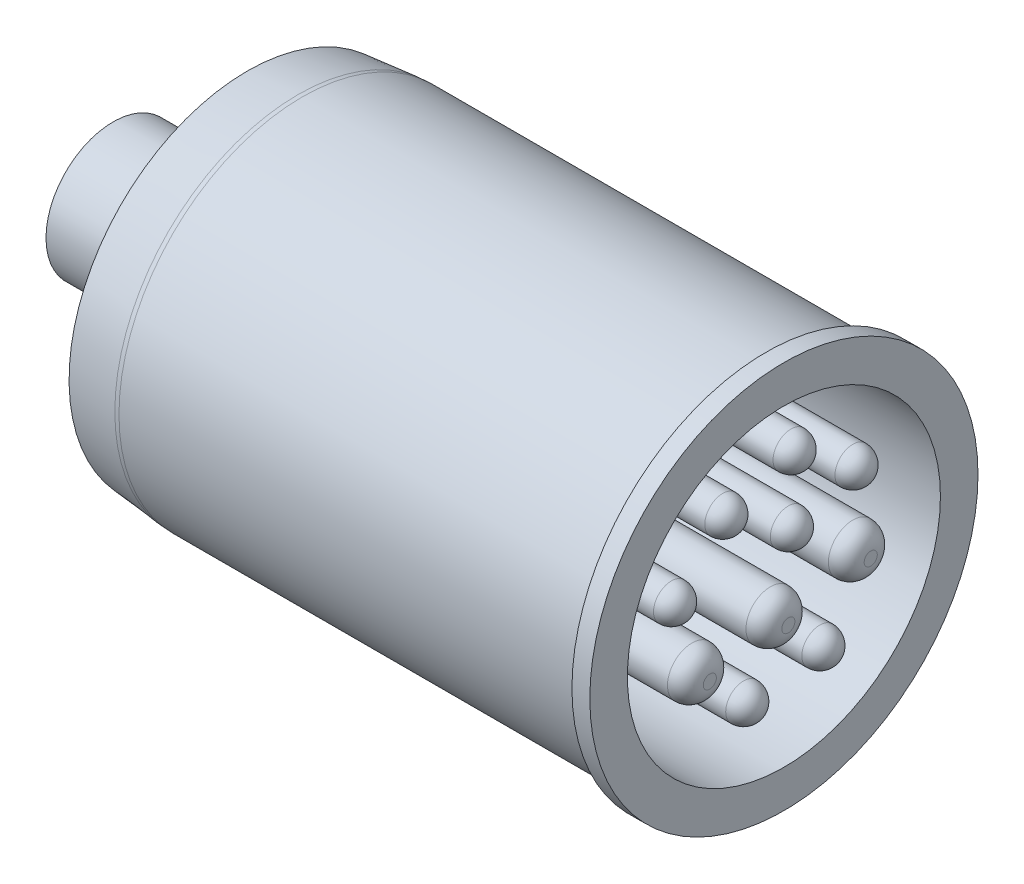
ISO-10303-21;
HEADER;
FILE_DESCRIPTION(('STEP AP214'),'2;1');
FILE_NAME('part.step','',(''),(''),'','','');
FILE_SCHEMA(('AUTOMOTIVE_DESIGN { 1 0 10303 214 1 1 1 1 }'));
ENDSEC;
DATA;
#1=APPLICATION_CONTEXT('core data for automotive mechanical design processes');
#2=APPLICATION_PROTOCOL_DEFINITION('international standard','automotive_design',2000,#1);
#3=PRODUCT_CONTEXT('',#1,'mechanical');
#4=PRODUCT('Part','Part','',(#3));
#5=PRODUCT_RELATED_PRODUCT_CATEGORY('part','',(#4));
#6=PRODUCT_DEFINITION_FORMATION('','',#4);
#7=PRODUCT_DEFINITION_CONTEXT('part definition',#1,'design');
#8=PRODUCT_DEFINITION('design','',#6,#7);
#9=PRODUCT_DEFINITION_SHAPE('','',#8);
#10=(LENGTH_UNIT() NAMED_UNIT(*) SI_UNIT(.MILLI.,.METRE.));
#11=(NAMED_UNIT(*) PLANE_ANGLE_UNIT() SI_UNIT($,.RADIAN.));
#12=(NAMED_UNIT(*) SI_UNIT($,.STERADIAN.) SOLID_ANGLE_UNIT());
#13=UNCERTAINTY_MEASURE_WITH_UNIT(LENGTH_MEASURE(1.E-05),#10,'distance_accuracy_value','');
#14=(GEOMETRIC_REPRESENTATION_CONTEXT(3) GLOBAL_UNCERTAINTY_ASSIGNED_CONTEXT((#13)) GLOBAL_UNIT_ASSIGNED_CONTEXT((#10,
#11,#12)) REPRESENTATION_CONTEXT('',''));
#15=CARTESIAN_POINT('',(0.,0.,0.));
#16=DIRECTION('',(0.,0.,1.));
#17=DIRECTION('',(1.,0.,0.));
#18=AXIS2_PLACEMENT_3D('',#15,#16,#17);
#19=CARTESIAN_POINT('',(-50.,0.,0.));
#20=DIRECTION('',(-1.,0.,0.));
#21=DIRECTION('',(0.,0.,1.));
#22=AXIS2_PLACEMENT_3D('',#19,#20,#21);
#23=CYLINDRICAL_SURFACE('',#22,20.5);
#24=CARTESIAN_POINT('',(-38.8416387865009,0.,0.));
#25=DIRECTION('',(1.,0.,0.));
#26=DIRECTION('',(0.,0.,-1.));
#27=AXIS2_PLACEMENT_3D('',#24,#25,#26);
#28=CIRCLE('',#27,20.5);
#29=CARTESIAN_POINT('',(-38.8416387865009,0.,-20.5));
#30=VERTEX_POINT('',#29);
#31=EDGE_CURVE('E107',#30,#30,#28,.T.);
#32=ORIENTED_EDGE('',*,*,#31,.T.);
#33=EDGE_LOOP('',(#32));
#34=FACE_BOUND('',#33,.T.);
#35=CARTESIAN_POINT('',(13.,0.,0.));
#36=DIRECTION('',(1.,0.,0.));
#37=DIRECTION('',(0.,0.,-1.));
#38=AXIS2_PLACEMENT_3D('',#35,#36,#37);
#39=CIRCLE('',#38,20.5);
#40=CARTESIAN_POINT('',(13.,0.,-20.5));
#41=VERTEX_POINT('',#40);
#42=EDGE_CURVE('E148',#41,#41,#39,.T.);
#43=ORIENTED_EDGE('',*,*,#42,.F.);
#44=EDGE_LOOP('',(#43));
#45=FACE_BOUND('',#44,.T.);
#46=ADVANCED_FACE('F46',(#34,#45),#23,.T.);
#47=CARTESIAN_POINT('',(-39.0852714226534,0.,0.));
#48=DIRECTION('',(1.,0.,0.));
#49=DIRECTION('',(0.,0.,-1.));
#50=AXIS2_PLACEMENT_3D('',#47,#48,#49);
#51=CONICAL_SURFACE('',#50,20.5,0.0973760373811173);
#52=CARTESIAN_POINT('',(-45.,0.,0.));
#53=DIRECTION('',(1.,0.,0.));
#54=DIRECTION('',(0.,1.,0.));
#55=AXIS2_PLACEMENT_3D('',#52,#53,#54);
#56=CIRCLE('',#55,19.9222198251195);
#57=CARTESIAN_POINT('',(-45.,19.9222198251195,0.));
#58=VERTEX_POINT('',#57);
#59=EDGE_CURVE('E106',#58,#58,#56,.T.);
#60=ORIENTED_EDGE('',*,*,#59,.T.);
#61=EDGE_LOOP('',(#60));
#62=FACE_BOUND('',#61,.T.);
#63=CARTESIAN_POINT('',(-39.3277498976119,0.,0.));
#64=DIRECTION('',(-1.,0.,0.));
#65=DIRECTION('',(0.,0.,1.));
#66=AXIS2_PLACEMENT_3D('',#63,#64,#65);
#67=CIRCLE('',#66,20.4763134937074);
#68=CARTESIAN_POINT('',(-39.3277498976119,0.,20.4763134937074));
#69=VERTEX_POINT('',#68);
#70=EDGE_CURVE('E103',#69,#69,#67,.T.);
#71=ORIENTED_EDGE('',*,*,#70,.T.);
#72=EDGE_LOOP('',(#71));
#73=FACE_BOUND('',#72,.T.);
#74=ADVANCED_FACE('F166',(#62,#73),#51,.T.);
#75=CARTESIAN_POINT('',(-38.8416387865009,0.,0.));
#76=DIRECTION('',(1.,0.,0.));
#77=DIRECTION('',(0.,0.,-1.));
#78=AXIS2_PLACEMENT_3D('',#75,#76,#77);
#79=TOROIDAL_SURFACE('',#78,15.5,5.);
#80=ORIENTED_EDGE('',*,*,#31,.F.);
#81=EDGE_LOOP('',(#80));
#82=FACE_BOUND('',#81,.T.);
#83=ORIENTED_EDGE('',*,*,#70,.F.);
#84=EDGE_LOOP('',(#83));
#85=FACE_BOUND('',#84,.T.);
#86=ADVANCED_FACE('F184',(#82,#85),#79,.T.);
#87=CARTESIAN_POINT('',(13.,0.,0.));
#88=DIRECTION('',(1.,0.,0.));
#89=DIRECTION('',(0.,0.,-1.));
#90=AXIS2_PLACEMENT_3D('',#87,#88,#89);
#91=CYLINDRICAL_SURFACE('',#90,21.7);
#92=CARTESIAN_POINT('',(13.,0.,0.));
#93=DIRECTION('',(1.,0.,0.));
#94=DIRECTION('',(0.,0.,-1.));
#95=AXIS2_PLACEMENT_3D('',#92,#93,#94);
#96=CIRCLE('',#95,21.7);
#97=CARTESIAN_POINT('',(13.,0.,-21.7));
#98=VERTEX_POINT('',#97);
#99=EDGE_CURVE('E50',#98,#98,#96,.T.);
#100=ORIENTED_EDGE('',*,*,#99,.T.);
#101=EDGE_LOOP('',(#100));
#102=FACE_BOUND('',#101,.T.);
#103=CARTESIAN_POINT('',(15.,0.,0.));
#104=DIRECTION('',(1.,0.,0.));
#105=DIRECTION('',(0.,0.,-1.));
#106=AXIS2_PLACEMENT_3D('',#103,#104,#105);
#107=CIRCLE('',#106,21.7);
#108=CARTESIAN_POINT('',(15.,0.,-21.7));
#109=VERTEX_POINT('',#108);
#110=EDGE_CURVE('E12',#109,#109,#107,.T.);
#111=ORIENTED_EDGE('',*,*,#110,.F.);
#112=EDGE_LOOP('',(#111));
#113=FACE_BOUND('',#112,.T.);
#114=ADVANCED_FACE('F278',(#102,#113),#91,.T.);
#115=CARTESIAN_POINT('',(13.,0.,0.));
#116=DIRECTION('',(1.,0.,0.));
#117=DIRECTION('',(0.,0.,-1.));
#118=AXIS2_PLACEMENT_3D('',#115,#116,#117);
#119=PLANE('',#118);
#120=ORIENTED_EDGE('',*,*,#42,.T.);
#121=EDGE_LOOP('',(#120));
#122=FACE_BOUND('',#121,.T.);
#123=ORIENTED_EDGE('',*,*,#99,.F.);
#124=EDGE_LOOP('',(#123));
#125=FACE_BOUND('',#124,.T.);
#126=ADVANCED_FACE('F206',(#122,#125),#119,.F.);
#127=CARTESIAN_POINT('',(15.,0.,0.));
#128=DIRECTION('',(-1.,0.,0.));
#129=DIRECTION('',(0.,0.,1.));
#130=AXIS2_PLACEMENT_3D('',#127,#128,#129);
#131=PLANE('',#130);
#132=CARTESIAN_POINT('',(15.,3.56731656131285,-2.48519986218187));
#133=DIRECTION('',(-1.,0.,0.));
#134=DIRECTION('',(0.,0.,1.));
#135=AXIS2_PLACEMENT_3D('',#132,#133,#134);
#136=CIRCLE('',#135,0.000606669885716993);
#137=CARTESIAN_POINT('',(15.,3.56731656131285,-2.48459319229615));
#138=VERTEX_POINT('',#137);
#139=EDGE_CURVE('E144',#138,#138,#136,.F.);
#140=ORIENTED_EDGE('',*,*,#139,.T.);
#141=EDGE_LOOP('',(#140));
#142=FACE_BOUND('',#141,.T.);
#143=ADVANCED_FACE('F202',(#142),#131,.F.);
#144=CARTESIAN_POINT('',(15.,0.,0.));
#145=DIRECTION('',(-1.,0.,0.));
#146=DIRECTION('',(0.,0.,1.));
#147=AXIS2_PLACEMENT_3D('',#144,#145,#146);
#148=PLANE('',#147);
#149=CARTESIAN_POINT('',(15.,10.8693952367516,-2.78447552930021));
#150=DIRECTION('',(-1.,0.,0.));
#151=DIRECTION('',(0.,0.,1.));
#152=AXIS2_PLACEMENT_3D('',#149,#150,#151);
#153=CIRCLE('',#152,0.000606669885715692);
#154=CARTESIAN_POINT('',(15.,10.8693952367516,-2.78386885941449));
#155=VERTEX_POINT('',#154);
#156=EDGE_CURVE('E147',#155,#155,#153,.F.);
#157=ORIENTED_EDGE('',*,*,#156,.T.);
#158=EDGE_LOOP('',(#157));
#159=FACE_BOUND('',#158,.T.);
#160=ADVANCED_FACE('F205',(#159),#148,.F.);
#161=CARTESIAN_POINT('',(15.,0.,0.));
#162=DIRECTION('',(-1.,0.,0.));
#163=DIRECTION('',(0.,0.,1.));
#164=AXIS2_PLACEMENT_3D('',#161,#162,#163);
#165=PLANE('',#164);
#166=CARTESIAN_POINT('',(15.,8.44417520421064,4.84394384578304));
#167=DIRECTION('',(-1.,0.,0.));
#168=DIRECTION('',(0.,0.,1.));
#169=AXIS2_PLACEMENT_3D('',#166,#167,#168);
#170=CIRCLE('',#169,0.000606669885717427);
#171=CARTESIAN_POINT('',(15.,8.44417520421064,4.84455051566875));
#172=VERTEX_POINT('',#171);
#173=EDGE_CURVE('E141',#172,#172,#170,.F.);
#174=ORIENTED_EDGE('',*,*,#173,.T.);
#175=EDGE_LOOP('',(#174));
#176=FACE_BOUND('',#175,.T.);
#177=ADVANCED_FACE('F214',(#176),#165,.F.);
#178=CARTESIAN_POINT('',(15.,0.,0.));
#179=DIRECTION('',(-1.,0.,0.));
#180=DIRECTION('',(0.,0.,1.));
#181=AXIS2_PLACEMENT_3D('',#178,#179,#180);
#182=PLANE('',#181);
#183=CARTESIAN_POINT('',(15.,2.84412167452525,10.5762821045161));
#184=DIRECTION('',(-1.,0.,0.));
#185=DIRECTION('',(0.,0.,1.));
#186=AXIS2_PLACEMENT_3D('',#183,#184,#185);
#187=CIRCLE('',#186,0.00060666988571656);
#188=CARTESIAN_POINT('',(15.,2.84412167452525,10.5768887744018));
#189=VERTEX_POINT('',#188);
#190=EDGE_CURVE('E138',#189,#189,#187,.F.);
#191=ORIENTED_EDGE('',*,*,#190,.T.);
#192=EDGE_LOOP('',(#191));
#193=FACE_BOUND('',#192,.T.);
#194=ADVANCED_FACE('F222',(#193),#182,.F.);
#195=CARTESIAN_POINT('',(15.,0.,0.));
#196=DIRECTION('',(-1.,0.,0.));
#197=DIRECTION('',(0.,0.,1.));
#198=AXIS2_PLACEMENT_3D('',#195,#196,#197);
#199=PLANE('',#198);
#200=CARTESIAN_POINT('',(15.,5.9307653523046,-9.70737634946245));
#201=DIRECTION('',(-1.,0.,0.));
#202=DIRECTION('',(0.,0.,1.));
#203=AXIS2_PLACEMENT_3D('',#200,#201,#202);
#204=CIRCLE('',#203,0.00060666988571656);
#205=CARTESIAN_POINT('',(15.,5.9307653523046,-9.70676967957674));
#206=VERTEX_POINT('',#205);
#207=EDGE_CURVE('E116',#206,#206,#204,.F.);
#208=ORIENTED_EDGE('',*,*,#207,.T.);
#209=EDGE_LOOP('',(#208));
#210=FACE_BOUND('',#209,.T.);
#211=ADVANCED_FACE('F230',(#210),#199,.F.);
#212=CARTESIAN_POINT('',(15.,0.,0.));
#213=DIRECTION('',(-1.,0.,0.));
#214=DIRECTION('',(0.,0.,1.));
#215=AXIS2_PLACEMENT_3D('',#212,#213,#214);
#216=PLANE('',#215);
#217=CARTESIAN_POINT('',(15.,-10.8693952367516,2.50691363260725));
#218=DIRECTION('',(-1.,0.,0.));
#219=DIRECTION('',(0.,0.,1.));
#220=AXIS2_PLACEMENT_3D('',#217,#218,#219);
#221=CIRCLE('',#220,0.000606669885717427);
#222=CARTESIAN_POINT('',(15.,-10.8693952367516,2.50752030249297));
#223=VERTEX_POINT('',#222);
#224=EDGE_CURVE('E112',#223,#223,#221,.F.);
#225=ORIENTED_EDGE('',*,*,#224,.T.);
#226=EDGE_LOOP('',(#225));
#227=FACE_BOUND('',#226,.T.);
#228=ADVANCED_FACE('F238',(#227),#216,.F.);
#229=CARTESIAN_POINT('',(15.,0.,0.));
#230=DIRECTION('',(-1.,0.,0.));
#231=DIRECTION('',(0.,0.,1.));
#232=AXIS2_PLACEMENT_3D('',#229,#230,#231);
#233=PLANE('',#232);
#234=CARTESIAN_POINT('',(15.,-9.72292758500494,-6.00340393612724));
#235=DIRECTION('',(-1.,0.,0.));
#236=DIRECTION('',(0.,0.,1.));
#237=AXIS2_PLACEMENT_3D('',#234,#235,#236);
#238=CIRCLE('',#237,0.000606669885717427);
#239=CARTESIAN_POINT('',(15.,-9.72292758500494,-6.00279726624152));
#240=VERTEX_POINT('',#239);
#241=EDGE_CURVE('E115',#240,#240,#238,.F.);
#242=ORIENTED_EDGE('',*,*,#241,.T.);
#243=EDGE_LOOP('',(#242));
#244=FACE_BOUND('',#243,.T.);
#245=ADVANCED_FACE('F246',(#244),#233,.F.);
#246=CARTESIAN_POINT('',(15.,0.,0.));
#247=DIRECTION('',(-1.,0.,0.));
#248=DIRECTION('',(0.,0.,1.));
#249=AXIS2_PLACEMENT_3D('',#246,#247,#248);
#250=PLANE('',#249);
#251=CARTESIAN_POINT('',(15.,-2.13860311960426,-9.70737634946245));
#252=DIRECTION('',(-1.,0.,0.));
#253=DIRECTION('',(0.,0.,1.));
#254=AXIS2_PLACEMENT_3D('',#251,#252,#253);
#255=CIRCLE('',#254,0.733173099565215);
#256=CARTESIAN_POINT('',(15.,-2.13860311960426,-8.97420324989724));
#257=VERTEX_POINT('',#256);
#258=EDGE_CURVE('E121',#257,#257,#255,.F.);
#259=ORIENTED_EDGE('',*,*,#258,.T.);
#260=EDGE_LOOP('',(#259));
#261=FACE_BOUND('',#260,.T.);
#262=ADVANCED_FACE('F254',(#261),#250,.F.);
#263=CARTESIAN_POINT('',(15.,0.,0.));
#264=DIRECTION('',(-1.,0.,0.));
#265=DIRECTION('',(0.,0.,1.));
#266=AXIS2_PLACEMENT_3D('',#263,#264,#265);
#267=PLANE('',#266);
#268=CARTESIAN_POINT('',(15.,-3.99058932627187,-0.491540225806979));
#269=DIRECTION('',(-1.,0.,0.));
#270=DIRECTION('',(0.,0.,1.));
#271=AXIS2_PLACEMENT_3D('',#268,#269,#270);
#272=CIRCLE('',#271,0.733173099565215);
#273=CARTESIAN_POINT('',(15.,-3.99058932627187,0.241632873758237));
#274=VERTEX_POINT('',#273);
#275=EDGE_CURVE('E126',#274,#274,#272,.F.);
#276=ORIENTED_EDGE('',*,*,#275,.T.);
#277=EDGE_LOOP('',(#276));
#278=FACE_BOUND('',#277,.T.);
#279=ADVANCED_FACE('F262',(#278),#267,.F.);
#280=CARTESIAN_POINT('',(15.,0.,0.));
#281=DIRECTION('',(-1.,0.,0.));
#282=DIRECTION('',(0.,0.,1.));
#283=AXIS2_PLACEMENT_3D('',#280,#281,#282);
#284=PLANE('',#283);
#285=CARTESIAN_POINT('',(15.,-5.04886715865336,8.28334680102288));
#286=DIRECTION('',(-1.,0.,0.));
#287=DIRECTION('',(0.,0.,1.));
#288=AXIS2_PLACEMENT_3D('',#285,#286,#287);
#289=CIRCLE('',#288,0.733173099565215);
#290=CARTESIAN_POINT('',(15.,-5.04886715865336,9.0165199005881));
#291=VERTEX_POINT('',#290);
#292=EDGE_CURVE('E131',#291,#291,#289,.F.);
#293=ORIENTED_EDGE('',*,*,#292,.T.);
#294=EDGE_LOOP('',(#293));
#295=FACE_BOUND('',#294,.T.);
#296=ADVANCED_FACE('F269',(#295),#284,.F.);
#297=CARTESIAN_POINT('',(13.,3.56731656131285,-2.48519986218187));
#298=DIRECTION('',(-1.,0.,0.));
#299=DIRECTION('',(0.,0.,1.));
#300=AXIS2_PLACEMENT_3D('',#297,#298,#299);
#301=DEGENERATE_TOROIDAL_SURFACE('',#300,0.000606669885716993,2.,.T.);
#302=ORIENTED_EDGE('',*,*,#139,.F.);
#303=EDGE_LOOP('',(#302));
#304=FACE_BOUND('',#303,.T.);
#305=CARTESIAN_POINT('',(13.,3.56731656131285,-2.48519986218187));
#306=DIRECTION('',(-1.,0.,0.));
#307=DIRECTION('',(0.,0.,1.));
#308=AXIS2_PLACEMENT_3D('',#305,#306,#307);
#309=CIRCLE('',#308,2.00060666988572);
#310=CARTESIAN_POINT('',(13.,3.56731656131285,-0.484593192296154));
#311=VERTEX_POINT('',#310);
#312=EDGE_CURVE('E100',#311,#311,#309,.T.);
#313=ORIENTED_EDGE('',*,*,#312,.F.);
#314=EDGE_LOOP('',(#313));
#315=FACE_BOUND('',#314,.T.);
#316=ADVANCED_FACE('F276',(#304,#315),#301,.T.);
#317=CARTESIAN_POINT('',(13.,10.8693952367516,-2.78447552930021));
#318=DIRECTION('',(-1.,0.,0.));
#319=DIRECTION('',(0.,0.,1.));
#320=AXIS2_PLACEMENT_3D('',#317,#318,#319);
#321=DEGENERATE_TOROIDAL_SURFACE('',#320,0.000606669885715692,2.,.T.);
#322=ORIENTED_EDGE('',*,*,#156,.F.);
#323=EDGE_LOOP('',(#322));
#324=FACE_BOUND('',#323,.T.);
#325=CARTESIAN_POINT('',(13.,10.8693952367516,-2.78447552930021));
#326=DIRECTION('',(-1.,0.,0.));
#327=DIRECTION('',(0.,0.,1.));
#328=AXIS2_PLACEMENT_3D('',#325,#326,#327);
#329=CIRCLE('',#328,2.00060666988572);
#330=CARTESIAN_POINT('',(13.,10.8693952367516,-0.783868859414489));
#331=VERTEX_POINT('',#330);
#332=EDGE_CURVE('E96',#331,#331,#329,.T.);
#333=ORIENTED_EDGE('',*,*,#332,.F.);
#334=EDGE_LOOP('',(#333));
#335=FACE_BOUND('',#334,.T.);
#336=ADVANCED_FACE('F360',(#324,#335),#321,.T.);
#337=CARTESIAN_POINT('',(13.,8.44417520421064,4.84394384578304));
#338=DIRECTION('',(-1.,0.,0.));
#339=DIRECTION('',(0.,0.,1.));
#340=AXIS2_PLACEMENT_3D('',#337,#338,#339);
#341=DEGENERATE_TOROIDAL_SURFACE('',#340,0.000606669885717427,2.,.T.);
#342=ORIENTED_EDGE('',*,*,#173,.F.);
#343=EDGE_LOOP('',(#342));
#344=FACE_BOUND('',#343,.T.);
#345=CARTESIAN_POINT('',(13.,8.44417520421064,4.84394384578304));
#346=DIRECTION('',(-1.,0.,0.));
#347=DIRECTION('',(0.,0.,1.));
#348=AXIS2_PLACEMENT_3D('',#345,#346,#347);
#349=CIRCLE('',#348,2.00060666988572);
#350=CARTESIAN_POINT('',(13.,8.44417520421064,6.84455051566875));
#351=VERTEX_POINT('',#350);
#352=EDGE_CURVE('E92',#351,#351,#349,.T.);
#353=ORIENTED_EDGE('',*,*,#352,.F.);
#354=EDGE_LOOP('',(#353));
#355=FACE_BOUND('',#354,.T.);
#356=ADVANCED_FACE('F369',(#344,#355),#341,.T.);
#357=CARTESIAN_POINT('',(13.,2.84412167452525,10.5762821045161));
#358=DIRECTION('',(-1.,0.,0.));
#359=DIRECTION('',(0.,0.,1.));
#360=AXIS2_PLACEMENT_3D('',#357,#358,#359);
#361=DEGENERATE_TOROIDAL_SURFACE('',#360,0.00060666988571656,2.,.T.);
#362=ORIENTED_EDGE('',*,*,#190,.F.);
#363=EDGE_LOOP('',(#362));
#364=FACE_BOUND('',#363,.T.);
#365=CARTESIAN_POINT('',(13.,2.84412167452525,10.5762821045161));
#366=DIRECTION('',(-1.,0.,0.));
#367=DIRECTION('',(0.,0.,1.));
#368=AXIS2_PLACEMENT_3D('',#365,#366,#367);
#369=CIRCLE('',#368,2.00060666988572);
#370=CARTESIAN_POINT('',(13.,2.84412167452525,12.5768887744018));
#371=VERTEX_POINT('',#370);
#372=EDGE_CURVE('E88',#371,#371,#369,.T.);
#373=ORIENTED_EDGE('',*,*,#372,.F.);
#374=EDGE_LOOP('',(#373));
#375=FACE_BOUND('',#374,.T.);
#376=ADVANCED_FACE('F378',(#364,#375),#361,.T.);
#377=CARTESIAN_POINT('',(13.,5.9307653523046,-9.70737634946245));
#378=DIRECTION('',(-1.,0.,0.));
#379=DIRECTION('',(0.,0.,1.));
#380=AXIS2_PLACEMENT_3D('',#377,#378,#379);
#381=DEGENERATE_TOROIDAL_SURFACE('',#380,0.00060666988571656,2.,.T.);
#382=ORIENTED_EDGE('',*,*,#207,.F.);
#383=EDGE_LOOP('',(#382));
#384=FACE_BOUND('',#383,.T.);
#385=CARTESIAN_POINT('',(13.,5.9307653523046,-9.70737634946245));
#386=DIRECTION('',(-1.,0.,0.));
#387=DIRECTION('',(0.,0.,1.));
#388=AXIS2_PLACEMENT_3D('',#385,#386,#387);
#389=CIRCLE('',#388,2.00060666988572);
#390=CARTESIAN_POINT('',(13.,5.9307653523046,-7.70676967957674));
#391=VERTEX_POINT('',#390);
#392=EDGE_CURVE('E84',#391,#391,#389,.T.);
#393=ORIENTED_EDGE('',*,*,#392,.F.);
#394=EDGE_LOOP('',(#393));
#395=FACE_BOUND('',#394,.T.);
#396=ADVANCED_FACE('F387',(#384,#395),#381,.T.);
#397=CARTESIAN_POINT('',(13.,-10.8693952367516,2.50691363260725));
#398=DIRECTION('',(-1.,0.,0.));
#399=DIRECTION('',(0.,0.,1.));
#400=AXIS2_PLACEMENT_3D('',#397,#398,#399);
#401=DEGENERATE_TOROIDAL_SURFACE('',#400,0.000606669885717427,2.,.T.);
#402=ORIENTED_EDGE('',*,*,#224,.F.);
#403=EDGE_LOOP('',(#402));
#404=FACE_BOUND('',#403,.T.);
#405=CARTESIAN_POINT('',(13.,-10.8693952367516,2.50691363260725));
#406=DIRECTION('',(-1.,0.,0.));
#407=DIRECTION('',(0.,0.,1.));
#408=AXIS2_PLACEMENT_3D('',#405,#406,#407);
#409=CIRCLE('',#408,2.00060666988572);
#410=CARTESIAN_POINT('',(13.,-10.8693952367516,4.50752030249297));
#411=VERTEX_POINT('',#410);
#412=EDGE_CURVE('E80',#411,#411,#409,.T.);
#413=ORIENTED_EDGE('',*,*,#412,.F.);
#414=EDGE_LOOP('',(#413));
#415=FACE_BOUND('',#414,.T.);
#416=ADVANCED_FACE('F396',(#404,#415),#401,.T.);
#417=CARTESIAN_POINT('',(13.,-9.72292758500494,-6.00340393612724));
#418=DIRECTION('',(-1.,0.,0.));
#419=DIRECTION('',(0.,0.,1.));
#420=AXIS2_PLACEMENT_3D('',#417,#418,#419);
#421=DEGENERATE_TOROIDAL_SURFACE('',#420,0.000606669885717427,2.,.T.);
#422=ORIENTED_EDGE('',*,*,#241,.F.);
#423=EDGE_LOOP('',(#422));
#424=FACE_BOUND('',#423,.T.);
#425=CARTESIAN_POINT('',(13.,-9.72292758500494,-6.00340393612724));
#426=DIRECTION('',(-1.,0.,0.));
#427=DIRECTION('',(0.,0.,1.));
#428=AXIS2_PLACEMENT_3D('',#425,#426,#427);
#429=CIRCLE('',#428,2.00060666988572);
#430=CARTESIAN_POINT('',(13.,-9.72292758500494,-4.00279726624152));
#431=VERTEX_POINT('',#430);
#432=EDGE_CURVE('E76',#431,#431,#429,.T.);
#433=ORIENTED_EDGE('',*,*,#432,.F.);
#434=EDGE_LOOP('',(#433));
#435=FACE_BOUND('',#434,.T.);
#436=ADVANCED_FACE('F405',(#424,#435),#421,.T.);
#437=CARTESIAN_POINT('',(13.,-2.13860311960426,-9.70737634946245));
#438=DIRECTION('',(-1.,0.,0.));
#439=DIRECTION('',(0.,0.,1.));
#440=AXIS2_PLACEMENT_3D('',#437,#438,#439);
#441=DEGENERATE_TOROIDAL_SURFACE('',#440,0.733173099565215,2.,.T.);
#442=ORIENTED_EDGE('',*,*,#258,.F.);
#443=EDGE_LOOP('',(#442));
#444=FACE_BOUND('',#443,.T.);
#445=CARTESIAN_POINT('',(13.,-2.13860311960426,-9.70737634946245));
#446=DIRECTION('',(-1.,0.,0.));
#447=DIRECTION('',(0.,0.,1.));
#448=AXIS2_PLACEMENT_3D('',#445,#446,#447);
#449=CIRCLE('',#448,2.73317309956522);
#450=CARTESIAN_POINT('',(13.,-2.13860311960426,-6.97420324989724));
#451=VERTEX_POINT('',#450);
#452=EDGE_CURVE('E72',#451,#451,#449,.T.);
#453=ORIENTED_EDGE('',*,*,#452,.F.);
#454=EDGE_LOOP('',(#453));
#455=FACE_BOUND('',#454,.T.);
#456=ADVANCED_FACE('F414',(#444,#455),#441,.T.);
#457=CARTESIAN_POINT('',(13.,-3.99058932627187,-0.491540225806979));
#458=DIRECTION('',(-1.,0.,0.));
#459=DIRECTION('',(0.,0.,1.));
#460=AXIS2_PLACEMENT_3D('',#457,#458,#459);
#461=DEGENERATE_TOROIDAL_SURFACE('',#460,0.733173099565215,2.,.T.);
#462=ORIENTED_EDGE('',*,*,#275,.F.);
#463=EDGE_LOOP('',(#462));
#464=FACE_BOUND('',#463,.T.);
#465=CARTESIAN_POINT('',(13.,-3.99058932627187,-0.491540225806979));
#466=DIRECTION('',(-1.,0.,0.));
#467=DIRECTION('',(0.,0.,1.));
#468=AXIS2_PLACEMENT_3D('',#465,#466,#467);
#469=CIRCLE('',#468,2.73317309956522);
#470=CARTESIAN_POINT('',(13.,-3.99058932627187,2.24163287375824));
#471=VERTEX_POINT('',#470);
#472=EDGE_CURVE('E68',#471,#471,#469,.T.);
#473=ORIENTED_EDGE('',*,*,#472,.F.);
#474=EDGE_LOOP('',(#473));
#475=FACE_BOUND('',#474,.T.);
#476=ADVANCED_FACE('F423',(#464,#475),#461,.T.);
#477=CARTESIAN_POINT('',(13.,-5.04886715865336,8.28334680102288));
#478=DIRECTION('',(-1.,0.,0.));
#479=DIRECTION('',(0.,0.,1.));
#480=AXIS2_PLACEMENT_3D('',#477,#478,#479);
#481=DEGENERATE_TOROIDAL_SURFACE('',#480,0.733173099565215,2.,.T.);
#482=ORIENTED_EDGE('',*,*,#292,.F.);
#483=EDGE_LOOP('',(#482));
#484=FACE_BOUND('',#483,.T.);
#485=CARTESIAN_POINT('',(13.,-5.04886715865336,8.28334680102288));
#486=DIRECTION('',(-1.,0.,0.));
#487=DIRECTION('',(0.,0.,1.));
#488=AXIS2_PLACEMENT_3D('',#485,#486,#487);
#489=CIRCLE('',#488,2.73317309956522);
#490=CARTESIAN_POINT('',(13.,-5.04886715865336,11.0165199005881));
#491=VERTEX_POINT('',#490);
#492=EDGE_CURVE('E64',#491,#491,#489,.T.);
#493=ORIENTED_EDGE('',*,*,#492,.F.);
#494=EDGE_LOOP('',(#493));
#495=FACE_BOUND('',#494,.T.);
#496=ADVANCED_FACE('F200',(#484,#495),#481,.T.);
#497=CARTESIAN_POINT('',(22.7305809314369,3.56731656131285,-2.48519986218187));
#498=DIRECTION('',(-1.,0.,0.));
#499=DIRECTION('',(0.,0.,1.));
#500=AXIS2_PLACEMENT_3D('',#497,#498,#499);
#501=CYLINDRICAL_SURFACE('',#500,2.00060666988572);
#502=ORIENTED_EDGE('',*,*,#312,.T.);
#503=EDGE_LOOP('',(#502));
#504=FACE_BOUND('',#503,.T.);
#505=CARTESIAN_POINT('',(-20.,3.56731656131285,-2.48519986218187));
#506=DIRECTION('',(1.,0.,0.));
#507=DIRECTION('',(0.,0.,-1.));
#508=AXIS2_PLACEMENT_3D('',#505,#506,#507);
#509=CIRCLE('',#508,2.00060666988572);
#510=CARTESIAN_POINT('',(-20.,3.56731656131285,-4.48580653206759));
#511=VERTEX_POINT('',#510);
#512=EDGE_CURVE('E97',#511,#511,#509,.T.);
#513=ORIENTED_EDGE('',*,*,#512,.T.);
#514=EDGE_LOOP('',(#513));
#515=FACE_BOUND('',#514,.T.);
#516=ADVANCED_FACE('F196',(#504,#515),#501,.T.);
#517=CARTESIAN_POINT('',(22.7305809314369,10.8693952367516,-2.78447552930021));
#518=DIRECTION('',(-1.,0.,0.));
#519=DIRECTION('',(0.,0.,1.));
#520=AXIS2_PLACEMENT_3D('',#517,#518,#519);
#521=CYLINDRICAL_SURFACE('',#520,2.00060666988572);
#522=ORIENTED_EDGE('',*,*,#332,.T.);
#523=EDGE_LOOP('',(#522));
#524=FACE_BOUND('',#523,.T.);
#525=CARTESIAN_POINT('',(-20.,10.8693952367516,-2.78447552930021));
#526=DIRECTION('',(1.,0.,0.));
#527=DIRECTION('',(0.,0.,-1.));
#528=AXIS2_PLACEMENT_3D('',#525,#526,#527);
#529=CIRCLE('',#528,2.00060666988572);
#530=CARTESIAN_POINT('',(-20.,10.8693952367516,-4.78508219918592));
#531=VERTEX_POINT('',#530);
#532=EDGE_CURVE('E93',#531,#531,#529,.T.);
#533=ORIENTED_EDGE('',*,*,#532,.T.);
#534=EDGE_LOOP('',(#533));
#535=FACE_BOUND('',#534,.T.);
#536=ADVANCED_FACE('F199',(#524,#535),#521,.T.);
#537=CARTESIAN_POINT('',(22.7305809314369,8.44417520421064,4.84394384578304));
#538=DIRECTION('',(-1.,0.,0.));
#539=DIRECTION('',(0.,0.,1.));
#540=AXIS2_PLACEMENT_3D('',#537,#538,#539);
#541=CYLINDRICAL_SURFACE('',#540,2.00060666988572);
#542=ORIENTED_EDGE('',*,*,#352,.T.);
#543=EDGE_LOOP('',(#542));
#544=FACE_BOUND('',#543,.T.);
#545=CARTESIAN_POINT('',(-20.,8.44417520421064,4.84394384578304));
#546=DIRECTION('',(1.,0.,0.));
#547=DIRECTION('',(0.,0.,-1.));
#548=AXIS2_PLACEMENT_3D('',#545,#546,#547);
#549=CIRCLE('',#548,2.00060666988572);
#550=CARTESIAN_POINT('',(-20.,8.44417520421064,2.84333717589732));
#551=VERTEX_POINT('',#550);
#552=EDGE_CURVE('E89',#551,#551,#549,.T.);
#553=ORIENTED_EDGE('',*,*,#552,.T.);
#554=EDGE_LOOP('',(#553));
#555=FACE_BOUND('',#554,.T.);
#556=ADVANCED_FACE('F210',(#544,#555),#541,.T.);
#557=CARTESIAN_POINT('',(22.7305809314369,2.84412167452525,10.5762821045161));
#558=DIRECTION('',(-1.,0.,0.));
#559=DIRECTION('',(0.,0.,1.));
#560=AXIS2_PLACEMENT_3D('',#557,#558,#559);
#561=CYLINDRICAL_SURFACE('',#560,2.00060666988572);
#562=ORIENTED_EDGE('',*,*,#372,.T.);
#563=EDGE_LOOP('',(#562));
#564=FACE_BOUND('',#563,.T.);
#565=CARTESIAN_POINT('',(-20.,2.84412167452525,10.5762821045161));
#566=DIRECTION('',(1.,0.,0.));
#567=DIRECTION('',(0.,0.,-1.));
#568=AXIS2_PLACEMENT_3D('',#565,#566,#567);
#569=CIRCLE('',#568,2.00060666988572);
#570=CARTESIAN_POINT('',(-20.,2.84412167452525,8.57567543463039));
#571=VERTEX_POINT('',#570);
#572=EDGE_CURVE('E85',#571,#571,#569,.T.);
#573=ORIENTED_EDGE('',*,*,#572,.T.);
#574=EDGE_LOOP('',(#573));
#575=FACE_BOUND('',#574,.T.);
#576=ADVANCED_FACE('F218',(#564,#575),#561,.T.);
#577=CARTESIAN_POINT('',(22.7305809314369,5.9307653523046,-9.70737634946245));
#578=DIRECTION('',(-1.,0.,0.));
#579=DIRECTION('',(0.,0.,1.));
#580=AXIS2_PLACEMENT_3D('',#577,#578,#579);
#581=CYLINDRICAL_SURFACE('',#580,2.00060666988572);
#582=ORIENTED_EDGE('',*,*,#392,.T.);
#583=EDGE_LOOP('',(#582));
#584=FACE_BOUND('',#583,.T.);
#585=CARTESIAN_POINT('',(-20.,5.9307653523046,-9.70737634946245));
#586=DIRECTION('',(1.,0.,0.));
#587=DIRECTION('',(0.,0.,-1.));
#588=AXIS2_PLACEMENT_3D('',#585,#586,#587);
#589=CIRCLE('',#588,2.00060666988572);
#590=CARTESIAN_POINT('',(-20.,5.9307653523046,-11.7079830193482));
#591=VERTEX_POINT('',#590);
#592=EDGE_CURVE('E81',#591,#591,#589,.T.);
#593=ORIENTED_EDGE('',*,*,#592,.T.);
#594=EDGE_LOOP('',(#593));
#595=FACE_BOUND('',#594,.T.);
#596=ADVANCED_FACE('F226',(#584,#595),#581,.T.);
#597=CARTESIAN_POINT('',(22.7305809314369,-10.8693952367516,2.50691363260725));
#598=DIRECTION('',(-1.,0.,0.));
#599=DIRECTION('',(0.,0.,1.));
#600=AXIS2_PLACEMENT_3D('',#597,#598,#599);
#601=CYLINDRICAL_SURFACE('',#600,2.00060666988572);
#602=ORIENTED_EDGE('',*,*,#412,.T.);
#603=EDGE_LOOP('',(#602));
#604=FACE_BOUND('',#603,.T.);
#605=CARTESIAN_POINT('',(-20.,-10.8693952367516,2.50691363260725));
#606=DIRECTION('',(1.,0.,0.));
#607=DIRECTION('',(0.,0.,-1.));
#608=AXIS2_PLACEMENT_3D('',#605,#606,#607);
#609=CIRCLE('',#608,2.00060666988572);
#610=CARTESIAN_POINT('',(-20.,-10.8693952367516,0.506306962721531));
#611=VERTEX_POINT('',#610);
#612=EDGE_CURVE('E77',#611,#611,#609,.T.);
#613=ORIENTED_EDGE('',*,*,#612,.T.);
#614=EDGE_LOOP('',(#613));
#615=FACE_BOUND('',#614,.T.);
#616=ADVANCED_FACE('F234',(#604,#615),#601,.T.);
#617=CARTESIAN_POINT('',(22.7305809314369,-9.72292758500494,-6.00340393612724));
#618=DIRECTION('',(-1.,0.,0.));
#619=DIRECTION('',(0.,0.,1.));
#620=AXIS2_PLACEMENT_3D('',#617,#618,#619);
#621=CYLINDRICAL_SURFACE('',#620,2.00060666988572);
#622=ORIENTED_EDGE('',*,*,#432,.T.);
#623=EDGE_LOOP('',(#622));
#624=FACE_BOUND('',#623,.T.);
#625=CARTESIAN_POINT('',(-20.,-9.72292758500494,-6.00340393612724));
#626=DIRECTION('',(1.,0.,0.));
#627=DIRECTION('',(0.,0.,-1.));
#628=AXIS2_PLACEMENT_3D('',#625,#626,#627);
#629=CIRCLE('',#628,2.00060666988572);
#630=CARTESIAN_POINT('',(-20.,-9.72292758500494,-8.00401060601296));
#631=VERTEX_POINT('',#630);
#632=EDGE_CURVE('E73',#631,#631,#629,.T.);
#633=ORIENTED_EDGE('',*,*,#632,.T.);
#634=EDGE_LOOP('',(#633));
#635=FACE_BOUND('',#634,.T.);
#636=ADVANCED_FACE('F242',(#624,#635),#621,.T.);
#637=CARTESIAN_POINT('',(22.7305809314369,-2.13860311960426,-9.70737634946245));
#638=DIRECTION('',(-1.,0.,0.));
#639=DIRECTION('',(0.,0.,1.));
#640=AXIS2_PLACEMENT_3D('',#637,#638,#639);
#641=CYLINDRICAL_SURFACE('',#640,2.73317309956522);
#642=ORIENTED_EDGE('',*,*,#452,.T.);
#643=EDGE_LOOP('',(#642));
#644=FACE_BOUND('',#643,.T.);
#645=CARTESIAN_POINT('',(-20.,-2.13860311960426,-9.70737634946245));
#646=DIRECTION('',(1.,0.,0.));
#647=DIRECTION('',(0.,0.,-1.));
#648=AXIS2_PLACEMENT_3D('',#645,#646,#647);
#649=CIRCLE('',#648,2.73317309956522);
#650=CARTESIAN_POINT('',(-20.,-2.13860311960426,-12.4405494490277));
#651=VERTEX_POINT('',#650);
#652=EDGE_CURVE('E69',#651,#651,#649,.T.);
#653=ORIENTED_EDGE('',*,*,#652,.T.);
#654=EDGE_LOOP('',(#653));
#655=FACE_BOUND('',#654,.T.);
#656=ADVANCED_FACE('F250',(#644,#655),#641,.T.);
#657=CARTESIAN_POINT('',(22.7305809314369,-3.99058932627187,-0.491540225806979));
#658=DIRECTION('',(-1.,0.,0.));
#659=DIRECTION('',(0.,0.,1.));
#660=AXIS2_PLACEMENT_3D('',#657,#658,#659);
#661=CYLINDRICAL_SURFACE('',#660,2.73317309956522);
#662=ORIENTED_EDGE('',*,*,#472,.T.);
#663=EDGE_LOOP('',(#662));
#664=FACE_BOUND('',#663,.T.);
#665=CARTESIAN_POINT('',(-20.,-3.99058932627187,-0.491540225806979));
#666=DIRECTION('',(1.,0.,0.));
#667=DIRECTION('',(0.,0.,-1.));
#668=AXIS2_PLACEMENT_3D('',#665,#666,#667);
#669=CIRCLE('',#668,2.73317309956522);
#670=CARTESIAN_POINT('',(-20.,-3.99058932627187,-3.22471332537219));
#671=VERTEX_POINT('',#670);
#672=EDGE_CURVE('E65',#671,#671,#669,.T.);
#673=ORIENTED_EDGE('',*,*,#672,.T.);
#674=EDGE_LOOP('',(#673));
#675=FACE_BOUND('',#674,.T.);
#676=ADVANCED_FACE('F258',(#664,#675),#661,.T.);
#677=CARTESIAN_POINT('',(22.7305809314369,-5.04886715865336,8.28334680102288));
#678=DIRECTION('',(-1.,0.,0.));
#679=DIRECTION('',(0.,0.,1.));
#680=AXIS2_PLACEMENT_3D('',#677,#678,#679);
#681=CYLINDRICAL_SURFACE('',#680,2.73317309956522);
#682=ORIENTED_EDGE('',*,*,#492,.T.);
#683=EDGE_LOOP('',(#682));
#684=FACE_BOUND('',#683,.T.);
#685=CARTESIAN_POINT('',(-20.,-5.04886715865336,8.28334680102288));
#686=DIRECTION('',(1.,0.,0.));
#687=DIRECTION('',(0.,0.,-1.));
#688=AXIS2_PLACEMENT_3D('',#685,#686,#687);
#689=CIRCLE('',#688,2.73317309956522);
#690=CARTESIAN_POINT('',(-20.,-5.04886715865336,5.55017370145766));
#691=VERTEX_POINT('',#690);
#692=EDGE_CURVE('E61',#691,#691,#689,.T.);
#693=ORIENTED_EDGE('',*,*,#692,.T.);
#694=EDGE_LOOP('',(#693));
#695=FACE_BOUND('',#694,.T.);
#696=ADVANCED_FACE('F194',(#684,#695),#681,.T.);
#697=CARTESIAN_POINT('',(-20.,0.,0.));
#698=DIRECTION('',(1.,0.,0.));
#699=DIRECTION('',(0.,0.,-1.));
#700=AXIS2_PLACEMENT_3D('',#697,#698,#699);
#701=PLANE('',#700);
#702=ORIENTED_EDGE('',*,*,#692,.F.);
#703=EDGE_LOOP('',(#702));
#704=FACE_BOUND('',#703,.T.);
#705=ORIENTED_EDGE('',*,*,#672,.F.);
#706=EDGE_LOOP('',(#705));
#707=FACE_BOUND('',#706,.T.);
#708=ORIENTED_EDGE('',*,*,#652,.F.);
#709=EDGE_LOOP('',(#708));
#710=FACE_BOUND('',#709,.T.);
#711=ORIENTED_EDGE('',*,*,#632,.F.);
#712=EDGE_LOOP('',(#711));
#713=FACE_BOUND('',#712,.T.);
#714=ORIENTED_EDGE('',*,*,#612,.F.);
#715=EDGE_LOOP('',(#714));
#716=FACE_BOUND('',#715,.T.);
#717=ORIENTED_EDGE('',*,*,#592,.F.);
#718=EDGE_LOOP('',(#717));
#719=FACE_BOUND('',#718,.T.);
#720=ORIENTED_EDGE('',*,*,#572,.F.);
#721=EDGE_LOOP('',(#720));
#722=FACE_BOUND('',#721,.T.);
#723=ORIENTED_EDGE('',*,*,#552,.F.);
#724=EDGE_LOOP('',(#723));
#725=FACE_BOUND('',#724,.T.);
#726=ORIENTED_EDGE('',*,*,#532,.F.);
#727=EDGE_LOOP('',(#726));
#728=FACE_BOUND('',#727,.T.);
#729=ORIENTED_EDGE('',*,*,#512,.F.);
#730=EDGE_LOOP('',(#729));
#731=FACE_BOUND('',#730,.T.);
#732=CARTESIAN_POINT('',(-20.,0.,0.));
#733=DIRECTION('',(1.,0.,0.));
#734=DIRECTION('',(0.,0.,-1.));
#735=AXIS2_PLACEMENT_3D('',#732,#733,#734);
#736=CIRCLE('',#735,17.5);
#737=CARTESIAN_POINT('',(-20.,0.,-17.5));
#738=VERTEX_POINT('',#737);
#739=EDGE_CURVE('E58',#738,#738,#736,.T.);
#740=ORIENTED_EDGE('',*,*,#739,.T.);
#741=EDGE_LOOP('',(#740));
#742=FACE_BOUND('',#741,.T.);
#743=ADVANCED_FACE('F190',(#704,#707,#710,#713,#716,#719,#722,#725,#728,#731,#742),#701,.T.);
#744=CARTESIAN_POINT('',(-20.,0.,0.));
#745=DIRECTION('',(1.,0.,0.));
#746=DIRECTION('',(0.,0.,-1.));
#747=AXIS2_PLACEMENT_3D('',#744,#745,#746);
#748=CYLINDRICAL_SURFACE('',#747,17.5);
#749=ORIENTED_EDGE('',*,*,#739,.F.);
#750=EDGE_LOOP('',(#749));
#751=FACE_BOUND('',#750,.T.);
#752=CARTESIAN_POINT('',(15.,0.,0.));
#753=DIRECTION('',(1.,0.,0.));
#754=DIRECTION('',(0.,0.,-1.));
#755=AXIS2_PLACEMENT_3D('',#752,#753,#754);
#756=CIRCLE('',#755,17.5);
#757=CARTESIAN_POINT('',(15.,0.,-17.5));
#758=VERTEX_POINT('',#757);
#759=EDGE_CURVE('E54',#758,#758,#756,.T.);
#760=ORIENTED_EDGE('',*,*,#759,.T.);
#761=EDGE_LOOP('',(#760));
#762=FACE_BOUND('',#761,.T.);
#763=ADVANCED_FACE('F175',(#751,#762),#748,.F.);
#764=CARTESIAN_POINT('',(15.,0.,0.));
#765=DIRECTION('',(-1.,0.,0.));
#766=DIRECTION('',(0.,0.,1.));
#767=AXIS2_PLACEMENT_3D('',#764,#765,#766);
#768=PLANE('',#767);
#769=ORIENTED_EDGE('',*,*,#759,.F.);
#770=EDGE_LOOP('',(#769));
#771=FACE_BOUND('',#770,.T.);
#772=ORIENTED_EDGE('',*,*,#110,.T.);
#773=EDGE_LOOP('',(#772));
#774=FACE_BOUND('',#773,.T.);
#775=ADVANCED_FACE('F170',(#771,#774),#768,.F.);
#776=CARTESIAN_POINT('',(-45.,24.858102264322,-23.5));
#777=DIRECTION('',(1.,0.,0.));
#778=DIRECTION('',(0.,1.,0.));
#779=AXIS2_PLACEMENT_3D('',#776,#777,#778);
#780=PLANE('',#779);
#781=ORIENTED_EDGE('',*,*,#59,.F.);
#782=EDGE_LOOP('',(#781));
#783=FACE_BOUND('',#782,.T.);
#784=ADVANCED_FACE('F48',(#783),#780,.F.);
#785=CLOSED_SHELL('',(#46,#74,#86,#114,#126,#143,#160,#177,#194,#211,#228,#245,#262,#279,#296,
#316,#336,#356,#376,#396,#416,#436,#456,#476,#496,#516,#536,#556,#576,#596,#616,#636,#656,#676,
#696,#743,#763,#775,#784));
#786=MANIFOLD_SOLID_BREP('B2',#785);
#787=CARTESIAN_POINT('',(-60.,0.,0.));
#788=DIRECTION('',(1.,0.,0.));
#789=DIRECTION('',(0.,0.,-1.));
#790=AXIS2_PLACEMENT_3D('',#787,#788,#789);
#791=CYLINDRICAL_SURFACE('',#790,7.);
#792=CARTESIAN_POINT('',(-60.,0.,0.));
#793=DIRECTION('',(-1.,0.,0.));
#794=DIRECTION('',(0.,0.,1.));
#795=AXIS2_PLACEMENT_3D('',#792,#793,#794);
#796=CIRCLE('',#795,7.);
#797=CARTESIAN_POINT('',(-60.,0.,7.));
#798=VERTEX_POINT('',#797);
#799=EDGE_CURVE('E636',#798,#798,#796,.T.);
#800=ORIENTED_EDGE('',*,*,#799,.T.);
#801=EDGE_LOOP('',(#800));
#802=FACE_BOUND('',#801,.T.);
#803=CARTESIAN_POINT('',(-45.,0.,0.));
#804=DIRECTION('',(-1.,0.,0.));
#805=DIRECTION('',(0.,0.,1.));
#806=AXIS2_PLACEMENT_3D('',#803,#804,#805);
#807=CIRCLE('',#806,7.);
#808=CARTESIAN_POINT('',(-45.,0.,7.));
#809=VERTEX_POINT('',#808);
#810=EDGE_CURVE('E640',#809,#809,#807,.T.);
#811=ORIENTED_EDGE('',*,*,#810,.F.);
#812=EDGE_LOOP('',(#811));
#813=FACE_BOUND('',#812,.T.);
#814=ADVANCED_FACE('F629',(#802,#813),#791,.F.);
#815=CARTESIAN_POINT('',(-60.,0.,0.));
#816=DIRECTION('',(-1.,0.,0.));
#817=DIRECTION('',(0.,0.,1.));
#818=AXIS2_PLACEMENT_3D('',#815,#816,#817);
#819=PLANE('',#818);
#820=CARTESIAN_POINT('',(-60.,0.,0.));
#821=DIRECTION('',(-1.,0.,0.));
#822=DIRECTION('',(0.,0.,1.));
#823=AXIS2_PLACEMENT_3D('',#820,#821,#822);
#824=CIRCLE('',#823,7.5);
#825=CARTESIAN_POINT('',(-60.,0.,7.5));
#826=VERTEX_POINT('',#825);
#827=EDGE_CURVE('E45',#826,#826,#824,.T.);
#828=ORIENTED_EDGE('',*,*,#827,.T.);
#829=EDGE_LOOP('',(#828));
#830=FACE_BOUND('',#829,.T.);
#831=ORIENTED_EDGE('',*,*,#799,.F.);
#832=EDGE_LOOP('',(#831));
#833=FACE_BOUND('',#832,.T.);
#834=ADVANCED_FACE('F659',(#830,#833),#819,.T.);
#835=CARTESIAN_POINT('',(-60.,0.,0.));
#836=DIRECTION('',(1.,0.,0.));
#837=DIRECTION('',(0.,0.,-1.));
#838=AXIS2_PLACEMENT_3D('',#835,#836,#837);
#839=CYLINDRICAL_SURFACE('',#838,7.5);
#840=ORIENTED_EDGE('',*,*,#827,.F.);
#841=EDGE_LOOP('',(#840));
#842=FACE_BOUND('',#841,.T.);
#843=CARTESIAN_POINT('',(-45.,0.,0.));
#844=DIRECTION('',(-1.,0.,0.));
#845=DIRECTION('',(0.,0.,1.));
#846=AXIS2_PLACEMENT_3D('',#843,#844,#845);
#847=CIRCLE('',#846,7.5);
#848=CARTESIAN_POINT('',(-45.,0.,7.5));
#849=VERTEX_POINT('',#848);
#850=EDGE_CURVE('E645',#849,#849,#847,.T.);
#851=ORIENTED_EDGE('',*,*,#850,.T.);
#852=EDGE_LOOP('',(#851));
#853=FACE_BOUND('',#852,.T.);
#854=ADVANCED_FACE('F631',(#842,#853),#839,.T.);
#855=CARTESIAN_POINT('',(-45.,24.858102264322,-23.5));
#856=DIRECTION('',(-1.,0.,0.));
#857=DIRECTION('',(0.,0.,1.));
#858=AXIS2_PLACEMENT_3D('',#855,#856,#857);
#859=PLANE('',#858);
#860=ORIENTED_EDGE('',*,*,#810,.T.);
#861=EDGE_LOOP('',(#860));
#862=FACE_BOUND('',#861,.T.);
#863=ORIENTED_EDGE('',*,*,#850,.F.);
#864=EDGE_LOOP('',(#863));
#865=FACE_BOUND('',#864,.T.);
#866=ADVANCED_FACE('F651',(#862,#865),#859,.F.);
#867=CLOSED_SHELL('',(#814,#834,#854,#866));
#868=MANIFOLD_SOLID_BREP('B7',#867);
#869=ADVANCED_BREP_SHAPE_REPRESENTATION('',(#18,#786,#868),#14);
#870=SHAPE_DEFINITION_REPRESENTATION(#9,#869);
ENDSEC;
END-ISO-10303-21;
